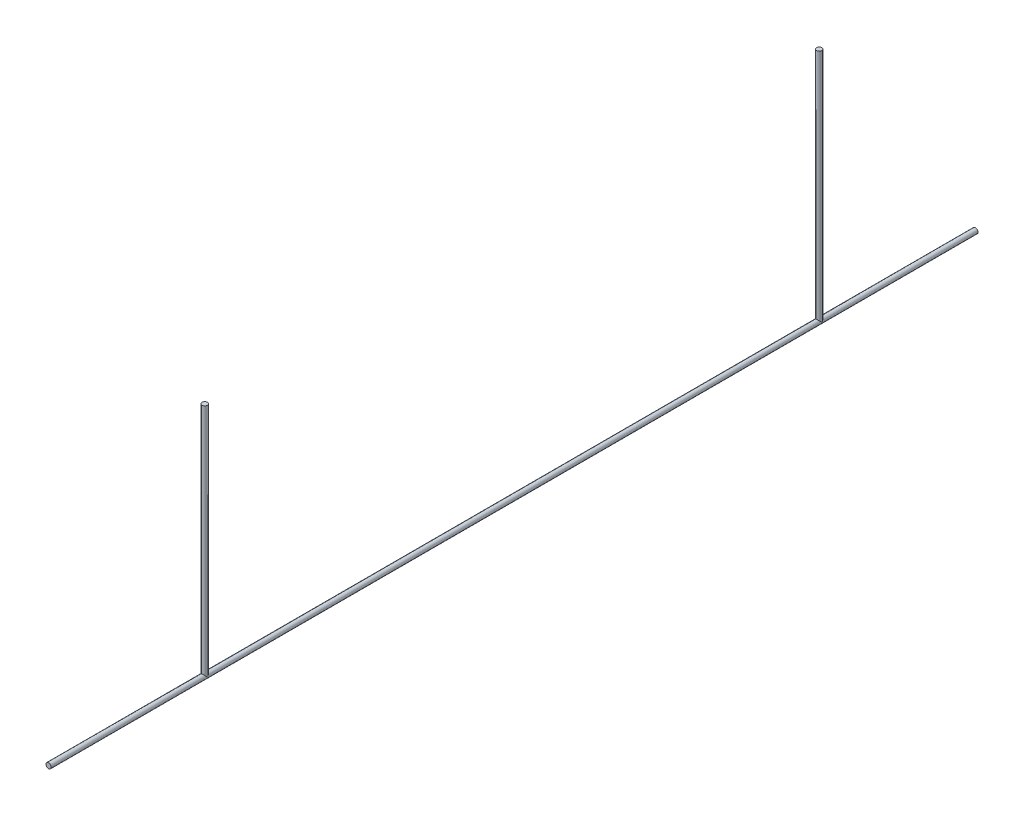
ISO-10303-21;
HEADER;
FILE_DESCRIPTION(('STEP AP214'),'2;1');
FILE_NAME('part.step','',(''),(''),'','','');
FILE_SCHEMA(('AUTOMOTIVE_DESIGN { 1 0 10303 214 1 1 1 1 }'));
ENDSEC;
DATA;
#1=APPLICATION_CONTEXT('core data for automotive mechanical design processes');
#2=APPLICATION_PROTOCOL_DEFINITION('international standard','automotive_design',2000,#1);
#3=PRODUCT_CONTEXT('',#1,'mechanical');
#4=PRODUCT('Part','Part','',(#3));
#5=PRODUCT_RELATED_PRODUCT_CATEGORY('part','',(#4));
#6=PRODUCT_DEFINITION_FORMATION('','',#4);
#7=PRODUCT_DEFINITION_CONTEXT('part definition',#1,'design');
#8=PRODUCT_DEFINITION('design','',#6,#7);
#9=PRODUCT_DEFINITION_SHAPE('','',#8);
#10=(LENGTH_UNIT() NAMED_UNIT(*) SI_UNIT(.MILLI.,.METRE.));
#11=(NAMED_UNIT(*) PLANE_ANGLE_UNIT() SI_UNIT($,.RADIAN.));
#12=(NAMED_UNIT(*) SI_UNIT($,.STERADIAN.) SOLID_ANGLE_UNIT());
#13=UNCERTAINTY_MEASURE_WITH_UNIT(LENGTH_MEASURE(1.E-05),#10,'distance_accuracy_value','');
#14=(GEOMETRIC_REPRESENTATION_CONTEXT(3) GLOBAL_UNCERTAINTY_ASSIGNED_CONTEXT((#13)) GLOBAL_UNIT_ASSIGNED_CONTEXT((#10,
#11,#12)) REPRESENTATION_CONTEXT('',''));
#15=CARTESIAN_POINT('',(0.,0.,0.));
#16=DIRECTION('',(0.,0.,1.));
#17=DIRECTION('',(1.,0.,0.));
#18=AXIS2_PLACEMENT_3D('',#15,#16,#17);
#19=CARTESIAN_POINT('',(0.,0.,1780.));
#20=DIRECTION('',(0.,0.,-1.));
#21=DIRECTION('',(-1.,0.,0.));
#22=AXIS2_PLACEMENT_3D('',#19,#20,#21);
#23=CYLINDRICAL_SURFACE('',#22,5.);
#24=CARTESIAN_POINT('',(0.,0.,300.));
#25=DIRECTION('',(0.,-0.707106781186547,-0.707106781186547));
#26=DIRECTION('',(0.,0.707106781186547,-0.707106781186547));
#27=AXIS2_PLACEMENT_3D('',#24,#25,#26);
#28=ELLIPSE('',#27,7.07106781186548,5.);
#29=CARTESIAN_POINT('',(5.,0.,300.));
#30=VERTEX_POINT('',#29);
#31=CARTESIAN_POINT('',(-5.,0.,300.));
#32=VERTEX_POINT('',#31);
#33=EDGE_CURVE('E60',#30,#32,#28,.F.);
#34=ORIENTED_EDGE('',*,*,#33,.F.);
#35=CARTESIAN_POINT('',(0.,0.,300.));
#36=DIRECTION('',(0.,0.707106781186547,-0.707106781186547));
#37=DIRECTION('',(0.,-0.707106781186547,-0.707106781186547));
#38=AXIS2_PLACEMENT_3D('',#35,#36,#37);
#39=ELLIPSE('',#38,7.07106781186548,5.);
#40=EDGE_CURVE('E53',#32,#30,#39,.T.);
#41=ORIENTED_EDGE('',*,*,#40,.F.);
#42=EDGE_LOOP('',(#34,#41));
#43=FACE_BOUND('',#42,.T.);
#44=CARTESIAN_POINT('',(0.,0.,1780.));
#45=DIRECTION('',(0.,0.,1.));
#46=DIRECTION('',(1.,0.,0.));
#47=AXIS2_PLACEMENT_3D('',#44,#45,#46);
#48=CIRCLE('',#47,5.);
#49=CARTESIAN_POINT('',(5.,0.,1780.));
#50=VERTEX_POINT('',#49);
#51=EDGE_CURVE('E64',#50,#50,#48,.T.);
#52=ORIENTED_EDGE('',*,*,#51,.F.);
#53=EDGE_LOOP('',(#52));
#54=FACE_BOUND('',#53,.T.);
#55=CARTESIAN_POINT('',(0.,0.,0.));
#56=DIRECTION('',(0.,0.,1.));
#57=DIRECTION('',(1.,0.,0.));
#58=AXIS2_PLACEMENT_3D('',#55,#56,#57);
#59=CIRCLE('',#58,5.);
#60=CARTESIAN_POINT('',(5.,0.,0.));
#61=VERTEX_POINT('',#60);
#62=EDGE_CURVE('E65',#61,#61,#59,.T.);
#63=ORIENTED_EDGE('',*,*,#62,.T.);
#64=EDGE_LOOP('',(#63));
#65=FACE_BOUND('',#64,.T.);
#66=CARTESIAN_POINT('',(0.,0.,1480.));
#67=DIRECTION('',(0.,-0.707106781186547,-0.707106781186547));
#68=DIRECTION('',(0.,0.707106781186547,-0.707106781186547));
#69=AXIS2_PLACEMENT_3D('',#66,#67,#68);
#70=ELLIPSE('',#69,7.07106781186548,5.);
#71=CARTESIAN_POINT('',(5.,0.,1480.));
#72=VERTEX_POINT('',#71);
#73=CARTESIAN_POINT('',(-5.,0.,1480.));
#74=VERTEX_POINT('',#73);
#75=EDGE_CURVE('E11',#72,#74,#70,.F.);
#76=ORIENTED_EDGE('',*,*,#75,.F.);
#77=CARTESIAN_POINT('',(0.,0.,1480.));
#78=DIRECTION('',(0.,0.707106781186547,-0.707106781186547));
#79=DIRECTION('',(0.,-0.707106781186547,-0.707106781186547));
#80=AXIS2_PLACEMENT_3D('',#77,#78,#79);
#81=ELLIPSE('',#80,7.07106781186548,5.);
#82=EDGE_CURVE('E42',#74,#72,#81,.T.);
#83=ORIENTED_EDGE('',*,*,#82,.F.);
#84=EDGE_LOOP('',(#76,#83));
#85=FACE_BOUND('',#84,.T.);
#86=ADVANCED_FACE('F35',(#43,#54,#65,#85),#23,.T.);
#87=CARTESIAN_POINT('',(0.,0.,1780.));
#88=DIRECTION('',(0.,0.,1.));
#89=DIRECTION('',(1.,0.,0.));
#90=AXIS2_PLACEMENT_3D('',#87,#88,#89);
#91=PLANE('',#90);
#92=ORIENTED_EDGE('',*,*,#51,.T.);
#93=EDGE_LOOP('',(#92));
#94=FACE_BOUND('',#93,.T.);
#95=ADVANCED_FACE('F91',(#94),#91,.T.);
#96=CARTESIAN_POINT('',(0.,0.,0.));
#97=DIRECTION('',(0.,0.,1.));
#98=DIRECTION('',(1.,0.,0.));
#99=AXIS2_PLACEMENT_3D('',#96,#97,#98);
#100=PLANE('',#99);
#101=ORIENTED_EDGE('',*,*,#62,.F.);
#102=EDGE_LOOP('',(#101));
#103=FACE_BOUND('',#102,.T.);
#104=ADVANCED_FACE('F95',(#103),#100,.F.);
#105=CARTESIAN_POINT('',(0.,452.,300.));
#106=DIRECTION('',(0.,-1.,0.));
#107=DIRECTION('',(0.,0.,-1.));
#108=AXIS2_PLACEMENT_3D('',#105,#106,#107);
#109=CYLINDRICAL_SURFACE('',#108,5.);
#110=CARTESIAN_POINT('',(0.,452.,300.));
#111=DIRECTION('',(0.,1.,0.));
#112=DIRECTION('',(0.,0.,1.));
#113=AXIS2_PLACEMENT_3D('',#110,#111,#112);
#114=CIRCLE('',#113,5.);
#115=CARTESIAN_POINT('',(0.,452.,305.));
#116=VERTEX_POINT('',#115);
#117=EDGE_CURVE('E68',#116,#116,#114,.T.);
#118=ORIENTED_EDGE('',*,*,#117,.F.);
#119=EDGE_LOOP('',(#118));
#120=FACE_BOUND('',#119,.T.);
#121=ORIENTED_EDGE('',*,*,#40,.T.);
#122=ORIENTED_EDGE('',*,*,#33,.T.);
#123=EDGE_LOOP('',(#121,#122));
#124=FACE_BOUND('',#123,.T.);
#125=ADVANCED_FACE('F87',(#120,#124),#109,.T.);
#126=CARTESIAN_POINT('',(0.,452.,300.));
#127=DIRECTION('',(0.,1.,0.));
#128=DIRECTION('',(0.,0.,1.));
#129=AXIS2_PLACEMENT_3D('',#126,#127,#128);
#130=PLANE('',#129);
#131=ORIENTED_EDGE('',*,*,#117,.T.);
#132=EDGE_LOOP('',(#131));
#133=FACE_BOUND('',#132,.T.);
#134=ADVANCED_FACE('F80',(#133),#130,.T.);
#135=CARTESIAN_POINT('',(0.,452.,1480.));
#136=DIRECTION('',(0.,-1.,0.));
#137=DIRECTION('',(0.,0.,-1.));
#138=AXIS2_PLACEMENT_3D('',#135,#136,#137);
#139=CYLINDRICAL_SURFACE('',#138,5.);
#140=CARTESIAN_POINT('',(0.,452.,1480.));
#141=DIRECTION('',(0.,1.,0.));
#142=DIRECTION('',(0.,0.,1.));
#143=AXIS2_PLACEMENT_3D('',#140,#141,#142);
#144=CIRCLE('',#143,5.);
#145=CARTESIAN_POINT('',(0.,452.,1485.));
#146=VERTEX_POINT('',#145);
#147=EDGE_CURVE('E73',#146,#146,#144,.T.);
#148=ORIENTED_EDGE('',*,*,#147,.F.);
#149=EDGE_LOOP('',(#148));
#150=FACE_BOUND('',#149,.T.);
#151=ORIENTED_EDGE('',*,*,#82,.T.);
#152=ORIENTED_EDGE('',*,*,#75,.T.);
#153=EDGE_LOOP('',(#151,#152));
#154=FACE_BOUND('',#153,.T.);
#155=ADVANCED_FACE('F59',(#150,#154),#139,.T.);
#156=CARTESIAN_POINT('',(0.,452.,1480.));
#157=DIRECTION('',(0.,1.,0.));
#158=DIRECTION('',(0.,0.,1.));
#159=AXIS2_PLACEMENT_3D('',#156,#157,#158);
#160=PLANE('',#159);
#161=ORIENTED_EDGE('',*,*,#147,.T.);
#162=EDGE_LOOP('',(#161));
#163=FACE_BOUND('',#162,.T.);
#164=ADVANCED_FACE('F77',(#163),#160,.T.);
#165=CLOSED_SHELL('',(#86,#95,#104,#125,#134,#155,#164));
#166=MANIFOLD_SOLID_BREP('B2',#165);
#167=ADVANCED_BREP_SHAPE_REPRESENTATION('',(#18,#166),#14);
#168=SHAPE_DEFINITION_REPRESENTATION(#9,#167);
ENDSEC;
END-ISO-10303-21;
